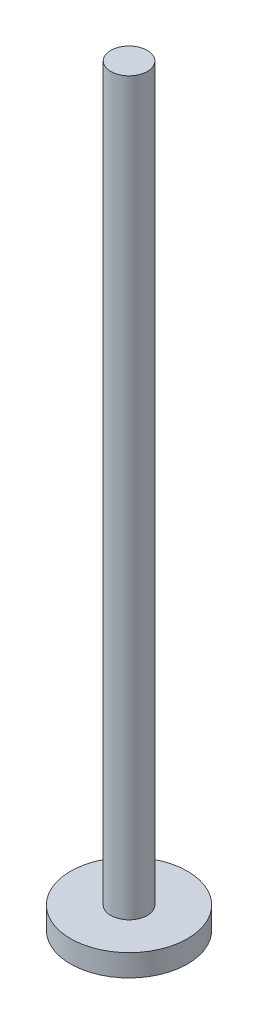
ISO-10303-21;
HEADER;
FILE_DESCRIPTION(('STEP AP214'),'2;1');
FILE_NAME('part.step','',(''),(''),'','','');
FILE_SCHEMA(('AUTOMOTIVE_DESIGN { 1 0 10303 214 1 1 1 1 }'));
ENDSEC;
DATA;
#1=APPLICATION_CONTEXT('core data for automotive mechanical design processes');
#2=APPLICATION_PROTOCOL_DEFINITION('international standard','automotive_design',2000,#1);
#3=PRODUCT_CONTEXT('',#1,'mechanical');
#4=PRODUCT('Part','Part','',(#3));
#5=PRODUCT_RELATED_PRODUCT_CATEGORY('part','',(#4));
#6=PRODUCT_DEFINITION_FORMATION('','',#4);
#7=PRODUCT_DEFINITION_CONTEXT('part definition',#1,'design');
#8=PRODUCT_DEFINITION('design','',#6,#7);
#9=PRODUCT_DEFINITION_SHAPE('','',#8);
#10=(LENGTH_UNIT() NAMED_UNIT(*) SI_UNIT(.MILLI.,.METRE.));
#11=(NAMED_UNIT(*) PLANE_ANGLE_UNIT() SI_UNIT($,.RADIAN.));
#12=(NAMED_UNIT(*) SI_UNIT($,.STERADIAN.) SOLID_ANGLE_UNIT());
#13=UNCERTAINTY_MEASURE_WITH_UNIT(LENGTH_MEASURE(1.E-05),#10,'distance_accuracy_value','');
#14=(GEOMETRIC_REPRESENTATION_CONTEXT(3) GLOBAL_UNCERTAINTY_ASSIGNED_CONTEXT((#13)) GLOBAL_UNIT_ASSIGNED_CONTEXT((#10,
#11,#12)) REPRESENTATION_CONTEXT('',''));
#15=CARTESIAN_POINT('',(0.,0.,0.));
#16=DIRECTION('',(0.,0.,1.));
#17=DIRECTION('',(1.,0.,0.));
#18=AXIS2_PLACEMENT_3D('',#15,#16,#17);
#19=CARTESIAN_POINT('',(0.,3.,0.));
#20=DIRECTION('',(0.,-1.,0.));
#21=DIRECTION('',(0.,0.,1.));
#22=AXIS2_PLACEMENT_3D('',#19,#20,#21);
#23=CYLINDRICAL_SURFACE('',#22,8.);
#24=CARTESIAN_POINT('',(0.,3.,0.));
#25=DIRECTION('',(0.,-1.,0.));
#26=DIRECTION('',(0.,0.,-1.));
#27=AXIS2_PLACEMENT_3D('',#24,#25,#26);
#28=CIRCLE('',#27,8.);
#29=CARTESIAN_POINT('',(0.,3.,-8.));
#30=VERTEX_POINT('',#29);
#31=EDGE_CURVE('E10',#30,#30,#28,.T.);
#32=ORIENTED_EDGE('',*,*,#31,.T.);
#33=EDGE_LOOP('',(#32));
#34=FACE_BOUND('',#33,.T.);
#35=CARTESIAN_POINT('',(0.,0.,0.));
#36=DIRECTION('',(0.,-1.,0.));
#37=DIRECTION('',(0.,0.,-1.));
#38=AXIS2_PLACEMENT_3D('',#35,#36,#37);
#39=CIRCLE('',#38,8.);
#40=CARTESIAN_POINT('',(0.,0.,-8.));
#41=VERTEX_POINT('',#40);
#42=EDGE_CURVE('E38',#41,#41,#39,.T.);
#43=ORIENTED_EDGE('',*,*,#42,.F.);
#44=EDGE_LOOP('',(#43));
#45=FACE_BOUND('',#44,.T.);
#46=ADVANCED_FACE('F35',(#34,#45),#23,.T.);
#47=CARTESIAN_POINT('',(0.,3.,0.));
#48=DIRECTION('',(0.,1.,0.));
#49=DIRECTION('',(0.,0.,-1.));
#50=AXIS2_PLACEMENT_3D('',#47,#48,#49);
#51=PLANE('',#50);
#52=CARTESIAN_POINT('',(0.,3.,0.));
#53=DIRECTION('',(0.,-1.,0.));
#54=DIRECTION('',(0.,0.,-1.));
#55=AXIS2_PLACEMENT_3D('',#52,#53,#54);
#56=CIRCLE('',#55,2.5);
#57=CARTESIAN_POINT('',(0.,3.,-2.5));
#58=VERTEX_POINT('',#57);
#59=EDGE_CURVE('E47',#58,#58,#56,.T.);
#60=ORIENTED_EDGE('',*,*,#59,.T.);
#61=EDGE_LOOP('',(#60));
#62=FACE_BOUND('',#61,.T.);
#63=ORIENTED_EDGE('',*,*,#31,.F.);
#64=EDGE_LOOP('',(#63));
#65=FACE_BOUND('',#64,.T.);
#66=ADVANCED_FACE('F65',(#62,#65),#51,.T.);
#67=CARTESIAN_POINT('',(0.,0.,0.));
#68=DIRECTION('',(0.,1.,0.));
#69=DIRECTION('',(0.,0.,-1.));
#70=AXIS2_PLACEMENT_3D('',#67,#68,#69);
#71=PLANE('',#70);
#72=ORIENTED_EDGE('',*,*,#42,.T.);
#73=EDGE_LOOP('',(#72));
#74=FACE_BOUND('',#73,.T.);
#75=ADVANCED_FACE('F62',(#74),#71,.F.);
#76=CARTESIAN_POINT('',(0.,103.,0.));
#77=DIRECTION('',(0.,-1.,0.));
#78=DIRECTION('',(0.,0.,1.));
#79=AXIS2_PLACEMENT_3D('',#76,#77,#78);
#80=CYLINDRICAL_SURFACE('',#79,2.5);
#81=CARTESIAN_POINT('',(0.,103.,0.));
#82=DIRECTION('',(0.,-1.,0.));
#83=DIRECTION('',(0.,0.,-1.));
#84=AXIS2_PLACEMENT_3D('',#81,#82,#83);
#85=CIRCLE('',#84,2.5);
#86=CARTESIAN_POINT('',(0.,103.,-2.5));
#87=VERTEX_POINT('',#86);
#88=EDGE_CURVE('E45',#87,#87,#85,.T.);
#89=ORIENTED_EDGE('',*,*,#88,.T.);
#90=EDGE_LOOP('',(#89));
#91=FACE_BOUND('',#90,.T.);
#92=ORIENTED_EDGE('',*,*,#59,.F.);
#93=EDGE_LOOP('',(#92));
#94=FACE_BOUND('',#93,.T.);
#95=ADVANCED_FACE('F53',(#91,#94),#80,.T.);
#96=CARTESIAN_POINT('',(0.,103.,0.));
#97=DIRECTION('',(0.,1.,0.));
#98=DIRECTION('',(0.,0.,-1.));
#99=AXIS2_PLACEMENT_3D('',#96,#97,#98);
#100=PLANE('',#99);
#101=ORIENTED_EDGE('',*,*,#88,.F.);
#102=EDGE_LOOP('',(#101));
#103=FACE_BOUND('',#102,.T.);
#104=ADVANCED_FACE('F56',(#103),#100,.T.);
#105=CLOSED_SHELL('',(#46,#66,#75,#95,#104));
#106=MANIFOLD_SOLID_BREP('B2',#105);
#107=ADVANCED_BREP_SHAPE_REPRESENTATION('',(#18,#106),#14);
#108=SHAPE_DEFINITION_REPRESENTATION(#9,#107);
ENDSEC;
END-ISO-10303-21;
